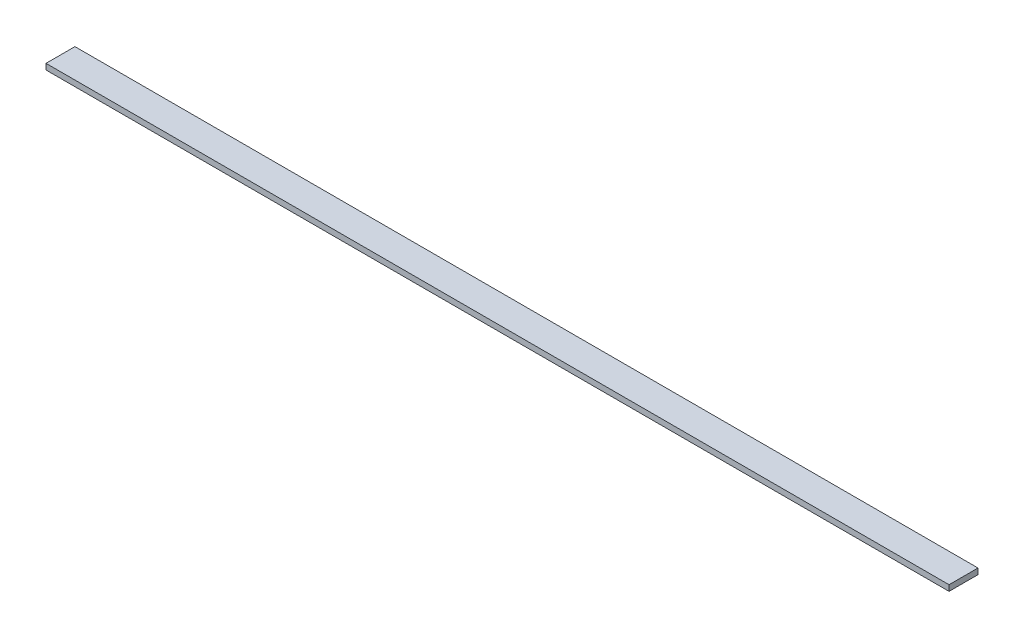
ISO-10303-21;
HEADER;
FILE_DESCRIPTION(('STEP AP214'),'2;1');
FILE_NAME('part.step','',(''),(''),'','','');
FILE_SCHEMA(('AUTOMOTIVE_DESIGN { 1 0 10303 214 1 1 1 1 }'));
ENDSEC;
DATA;
#1=APPLICATION_CONTEXT('core data for automotive mechanical design processes');
#2=APPLICATION_PROTOCOL_DEFINITION('international standard','automotive_design',2000,#1);
#3=PRODUCT_CONTEXT('',#1,'mechanical');
#4=PRODUCT('Part','Part','',(#3));
#5=PRODUCT_RELATED_PRODUCT_CATEGORY('part','',(#4));
#6=PRODUCT_DEFINITION_FORMATION('','',#4);
#7=PRODUCT_DEFINITION_CONTEXT('part definition',#1,'design');
#8=PRODUCT_DEFINITION('design','',#6,#7);
#9=PRODUCT_DEFINITION_SHAPE('','',#8);
#10=(LENGTH_UNIT() NAMED_UNIT(*) SI_UNIT(.MILLI.,.METRE.));
#11=(NAMED_UNIT(*) PLANE_ANGLE_UNIT() SI_UNIT($,.RADIAN.));
#12=(NAMED_UNIT(*) SI_UNIT($,.STERADIAN.) SOLID_ANGLE_UNIT());
#13=UNCERTAINTY_MEASURE_WITH_UNIT(LENGTH_MEASURE(1.E-05),#10,'distance_accuracy_value','');
#14=(GEOMETRIC_REPRESENTATION_CONTEXT(3) GLOBAL_UNCERTAINTY_ASSIGNED_CONTEXT((#13)) GLOBAL_UNIT_ASSIGNED_CONTEXT((#10,
#11,#12)) REPRESENTATION_CONTEXT('',''));
#15=CARTESIAN_POINT('',(0.,0.,0.));
#16=DIRECTION('',(0.,0.,1.));
#17=DIRECTION('',(1.,0.,0.));
#18=AXIS2_PLACEMENT_3D('',#15,#16,#17);
#19=CARTESIAN_POINT('',(0.,2.,0.));
#20=DIRECTION('',(1.,0.,0.));
#21=DIRECTION('',(0.,0.,-1.));
#22=AXIS2_PLACEMENT_3D('',#19,#20,#21);
#23=PLANE('',#22);
#24=DIRECTION('',(0.,0.,1.));
#25=VECTOR('',#24,1.);
#26=CARTESIAN_POINT('',(0.,0.,0.));
#27=LINE('',#26,#25);
#28=CARTESIAN_POINT('',(0.,0.,-10.));
#29=VERTEX_POINT('',#28);
#30=CARTESIAN_POINT('',(0.,0.,0.));
#31=VERTEX_POINT('',#30);
#32=EDGE_CURVE('E107',#29,#31,#27,.T.);
#33=ORIENTED_EDGE('',*,*,#32,.T.);
#34=DIRECTION('',(0.,-1.,0.));
#35=VECTOR('',#34,1.);
#36=CARTESIAN_POINT('',(0.,2.,0.));
#37=LINE('',#36,#35);
#38=CARTESIAN_POINT('',(0.,2.,0.));
#39=VERTEX_POINT('',#38);
#40=EDGE_CURVE('E11',#39,#31,#37,.T.);
#41=ORIENTED_EDGE('',*,*,#40,.F.);
#42=DIRECTION('',(0.,0.,1.));
#43=VECTOR('',#42,1.);
#44=CARTESIAN_POINT('',(0.,2.,0.));
#45=LINE('',#44,#43);
#46=CARTESIAN_POINT('',(0.,2.,-10.));
#47=VERTEX_POINT('',#46);
#48=EDGE_CURVE('E91',#47,#39,#45,.T.);
#49=ORIENTED_EDGE('',*,*,#48,.F.);
#50=DIRECTION('',(0.,-1.,0.));
#51=VECTOR('',#50,1.);
#52=CARTESIAN_POINT('',(0.,2.,-10.));
#53=LINE('',#52,#51);
#54=EDGE_CURVE('E103',#47,#29,#53,.T.);
#55=ORIENTED_EDGE('',*,*,#54,.T.);
#56=EDGE_LOOP('',(#33,#41,#49,#55));
#57=FACE_BOUND('',#56,.T.);
#58=ADVANCED_FACE('F39',(#57),#23,.F.);
#59=CARTESIAN_POINT('',(0.,2.,0.));
#60=DIRECTION('',(0.,0.,-1.));
#61=DIRECTION('',(-1.,0.,0.));
#62=AXIS2_PLACEMENT_3D('',#59,#60,#61);
#63=PLANE('',#62);
#64=DIRECTION('',(1.,0.,0.));
#65=VECTOR('',#64,1.);
#66=CARTESIAN_POINT('',(0.,0.,0.));
#67=LINE('',#66,#65);
#68=CARTESIAN_POINT('',(312.,0.,0.));
#69=VERTEX_POINT('',#68);
#70=EDGE_CURVE('E96',#31,#69,#67,.T.);
#71=ORIENTED_EDGE('',*,*,#70,.T.);
#72=DIRECTION('',(0.,-1.,0.));
#73=VECTOR('',#72,1.);
#74=CARTESIAN_POINT('',(312.,2.,0.));
#75=LINE('',#74,#73);
#76=CARTESIAN_POINT('',(312.,2.,0.));
#77=VERTEX_POINT('',#76);
#78=EDGE_CURVE('E48',#77,#69,#75,.T.);
#79=ORIENTED_EDGE('',*,*,#78,.F.);
#80=DIRECTION('',(1.,0.,0.));
#81=VECTOR('',#80,1.);
#82=CARTESIAN_POINT('',(0.,2.,0.));
#83=LINE('',#82,#81);
#84=EDGE_CURVE('E86',#39,#77,#83,.T.);
#85=ORIENTED_EDGE('',*,*,#84,.F.);
#86=ORIENTED_EDGE('',*,*,#40,.T.);
#87=EDGE_LOOP('',(#71,#79,#85,#86));
#88=FACE_BOUND('',#87,.T.);
#89=ADVANCED_FACE('F95',(#88),#63,.F.);
#90=CARTESIAN_POINT('',(312.,2.,0.));
#91=DIRECTION('',(-1.,0.,0.));
#92=DIRECTION('',(0.,0.,1.));
#93=AXIS2_PLACEMENT_3D('',#90,#91,#92);
#94=PLANE('',#93);
#95=DIRECTION('',(0.,0.,-1.));
#96=VECTOR('',#95,1.);
#97=CARTESIAN_POINT('',(312.,0.,0.));
#98=LINE('',#97,#96);
#99=CARTESIAN_POINT('',(312.,0.,-10.));
#100=VERTEX_POINT('',#99);
#101=EDGE_CURVE('E73',#69,#100,#98,.T.);
#102=ORIENTED_EDGE('',*,*,#101,.T.);
#103=DIRECTION('',(0.,-1.,0.));
#104=VECTOR('',#103,1.);
#105=CARTESIAN_POINT('',(312.,2.,-10.));
#106=LINE('',#105,#104);
#107=CARTESIAN_POINT('',(312.,2.,-10.));
#108=VERTEX_POINT('',#107);
#109=EDGE_CURVE('E98',#108,#100,#106,.T.);
#110=ORIENTED_EDGE('',*,*,#109,.F.);
#111=DIRECTION('',(0.,0.,-1.));
#112=VECTOR('',#111,1.);
#113=CARTESIAN_POINT('',(312.,2.,0.));
#114=LINE('',#113,#112);
#115=EDGE_CURVE('E89',#77,#108,#114,.T.);
#116=ORIENTED_EDGE('',*,*,#115,.F.);
#117=ORIENTED_EDGE('',*,*,#78,.T.);
#118=EDGE_LOOP('',(#102,#110,#116,#117));
#119=FACE_BOUND('',#118,.T.);
#120=ADVANCED_FACE('F99',(#119),#94,.F.);
#121=CARTESIAN_POINT('',(0.,2.,-10.));
#122=DIRECTION('',(0.,0.,1.));
#123=DIRECTION('',(1.,0.,0.));
#124=AXIS2_PLACEMENT_3D('',#121,#122,#123);
#125=PLANE('',#124);
#126=DIRECTION('',(-1.,0.,0.));
#127=VECTOR('',#126,1.);
#128=CARTESIAN_POINT('',(0.,0.,-10.));
#129=LINE('',#128,#127);
#130=EDGE_CURVE('E79',#100,#29,#129,.T.);
#131=ORIENTED_EDGE('',*,*,#130,.T.);
#132=ORIENTED_EDGE('',*,*,#54,.F.);
#133=DIRECTION('',(-1.,0.,0.));
#134=VECTOR('',#133,1.);
#135=CARTESIAN_POINT('',(0.,2.,-10.));
#136=LINE('',#135,#134);
#137=EDGE_CURVE('E56',#108,#47,#136,.T.);
#138=ORIENTED_EDGE('',*,*,#137,.F.);
#139=ORIENTED_EDGE('',*,*,#109,.T.);
#140=EDGE_LOOP('',(#131,#132,#138,#139));
#141=FACE_BOUND('',#140,.T.);
#142=ADVANCED_FACE('F120',(#141),#125,.F.);
#143=CARTESIAN_POINT('',(0.,2.,0.));
#144=DIRECTION('',(0.,-1.,0.));
#145=DIRECTION('',(0.,0.,-1.));
#146=AXIS2_PLACEMENT_3D('',#143,#144,#145);
#147=PLANE('',#146);
#148=ORIENTED_EDGE('',*,*,#48,.T.);
#149=ORIENTED_EDGE('',*,*,#84,.T.);
#150=ORIENTED_EDGE('',*,*,#115,.T.);
#151=ORIENTED_EDGE('',*,*,#137,.T.);
#152=EDGE_LOOP('',(#148,#149,#150,#151));
#153=FACE_BOUND('',#152,.T.);
#154=ADVANCED_FACE('F87',(#153),#147,.F.);
#155=CARTESIAN_POINT('',(0.,0.,0.));
#156=DIRECTION('',(0.,-1.,0.));
#157=DIRECTION('',(0.,0.,-1.));
#158=AXIS2_PLACEMENT_3D('',#155,#156,#157);
#159=PLANE('',#158);
#160=ORIENTED_EDGE('',*,*,#32,.F.);
#161=ORIENTED_EDGE('',*,*,#130,.F.);
#162=ORIENTED_EDGE('',*,*,#101,.F.);
#163=ORIENTED_EDGE('',*,*,#70,.F.);
#164=EDGE_LOOP('',(#160,#161,#162,#163));
#165=FACE_BOUND('',#164,.T.);
#166=ADVANCED_FACE('F123',(#165),#159,.T.);
#167=CLOSED_SHELL('',(#58,#89,#120,#142,#154,#166));
#168=MANIFOLD_SOLID_BREP('B2',#167);
#169=ADVANCED_BREP_SHAPE_REPRESENTATION('',(#18,#168),#14);
#170=SHAPE_DEFINITION_REPRESENTATION(#9,#169);
ENDSEC;
END-ISO-10303-21;
